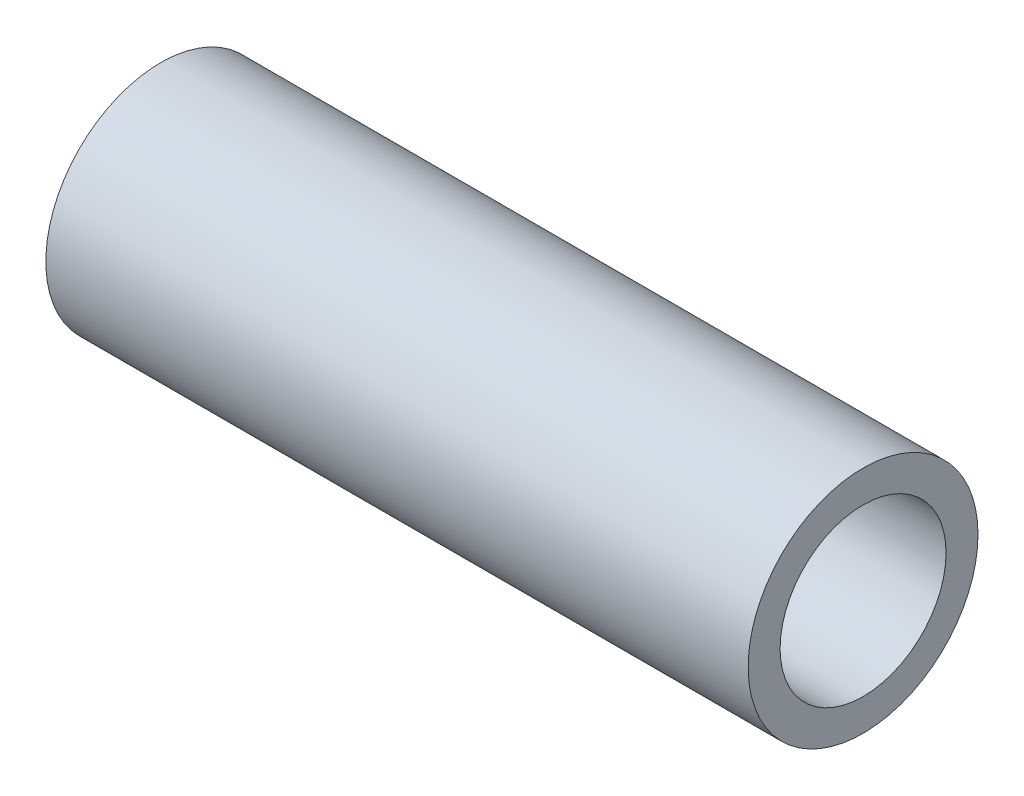
ISO-10303-21;
HEADER;
FILE_DESCRIPTION(('STEP AP214'),'2;1');
FILE_NAME('part.step','',(''),(''),'','','');
FILE_SCHEMA(('AUTOMOTIVE_DESIGN { 1 0 10303 214 1 1 1 1 }'));
ENDSEC;
DATA;
#1=APPLICATION_CONTEXT('core data for automotive mechanical design processes');
#2=APPLICATION_PROTOCOL_DEFINITION('international standard','automotive_design',2000,#1);
#3=PRODUCT_CONTEXT('',#1,'mechanical');
#4=PRODUCT('Part','Part','',(#3));
#5=PRODUCT_RELATED_PRODUCT_CATEGORY('part','',(#4));
#6=PRODUCT_DEFINITION_FORMATION('','',#4);
#7=PRODUCT_DEFINITION_CONTEXT('part definition',#1,'design');
#8=PRODUCT_DEFINITION('design','',#6,#7);
#9=PRODUCT_DEFINITION_SHAPE('','',#8);
#10=(LENGTH_UNIT() NAMED_UNIT(*) SI_UNIT(.MILLI.,.METRE.));
#11=(NAMED_UNIT(*) PLANE_ANGLE_UNIT() SI_UNIT($,.RADIAN.));
#12=(NAMED_UNIT(*) SI_UNIT($,.STERADIAN.) SOLID_ANGLE_UNIT());
#13=UNCERTAINTY_MEASURE_WITH_UNIT(LENGTH_MEASURE(1.E-05),#10,'distance_accuracy_value','');
#14=(GEOMETRIC_REPRESENTATION_CONTEXT(3) GLOBAL_UNCERTAINTY_ASSIGNED_CONTEXT((#13)) GLOBAL_UNIT_ASSIGNED_CONTEXT((#10,
#11,#12)) REPRESENTATION_CONTEXT('',''));
#15=CARTESIAN_POINT('',(0.,0.,0.));
#16=DIRECTION('',(0.,0.,1.));
#17=DIRECTION('',(1.,0.,0.));
#18=AXIS2_PLACEMENT_3D('',#15,#16,#17);
#19=CARTESIAN_POINT('',(27.5,0.,0.));
#20=DIRECTION('',(1.,0.,0.));
#21=DIRECTION('',(0.,0.,-1.));
#22=AXIS2_PLACEMENT_3D('',#19,#20,#21);
#23=PLANE('',#22);
#24=CARTESIAN_POINT('',(27.5,0.,0.));
#25=DIRECTION('',(1.,0.,0.));
#26=DIRECTION('',(0.,0.,-1.));
#27=AXIS2_PLACEMENT_3D('',#24,#25,#26);
#28=CIRCLE('',#27,9.00000000000001);
#29=CARTESIAN_POINT('',(27.5,0.,-9.00000000000001));
#30=VERTEX_POINT('',#29);
#31=EDGE_CURVE('E10',#30,#30,#28,.T.);
#32=ORIENTED_EDGE('',*,*,#31,.T.);
#33=EDGE_LOOP('',(#32));
#34=FACE_BOUND('',#33,.T.);
#35=CARTESIAN_POINT('',(27.5,0.,0.));
#36=DIRECTION('',(1.,0.,0.));
#37=DIRECTION('',(0.,0.,-1.));
#38=AXIS2_PLACEMENT_3D('',#35,#36,#37);
#39=CIRCLE('',#38,6.50000000000001);
#40=CARTESIAN_POINT('',(27.5,0.,-6.50000000000001));
#41=VERTEX_POINT('',#40);
#42=EDGE_CURVE('E46',#41,#41,#39,.T.);
#43=ORIENTED_EDGE('',*,*,#42,.F.);
#44=EDGE_LOOP('',(#43));
#45=FACE_BOUND('',#44,.T.);
#46=ADVANCED_FACE('F34',(#34,#45),#23,.T.);
#47=CARTESIAN_POINT('',(-27.5,0.,0.));
#48=DIRECTION('',(1.,0.,0.));
#49=DIRECTION('',(0.,0.,-1.));
#50=AXIS2_PLACEMENT_3D('',#47,#48,#49);
#51=PLANE('',#50);
#52=CARTESIAN_POINT('',(-27.5,0.,0.));
#53=DIRECTION('',(1.,0.,0.));
#54=DIRECTION('',(0.,0.,-1.));
#55=AXIS2_PLACEMENT_3D('',#52,#53,#54);
#56=CIRCLE('',#55,9.00000000000001);
#57=CARTESIAN_POINT('',(-27.5,0.,-9.00000000000001));
#58=VERTEX_POINT('',#57);
#59=EDGE_CURVE('E39',#58,#58,#56,.T.);
#60=ORIENTED_EDGE('',*,*,#59,.F.);
#61=EDGE_LOOP('',(#60));
#62=FACE_BOUND('',#61,.T.);
#63=CARTESIAN_POINT('',(-27.5,0.,0.));
#64=DIRECTION('',(1.,0.,0.));
#65=DIRECTION('',(0.,0.,-1.));
#66=AXIS2_PLACEMENT_3D('',#63,#64,#65);
#67=CIRCLE('',#66,6.50000000000001);
#68=CARTESIAN_POINT('',(-27.5,0.,-6.50000000000001));
#69=VERTEX_POINT('',#68);
#70=EDGE_CURVE('E48',#69,#69,#67,.T.);
#71=ORIENTED_EDGE('',*,*,#70,.T.);
#72=EDGE_LOOP('',(#71));
#73=FACE_BOUND('',#72,.T.);
#74=ADVANCED_FACE('F59',(#62,#73),#51,.F.);
#75=CARTESIAN_POINT('',(27.5,0.,0.));
#76=DIRECTION('',(-1.,0.,0.));
#77=DIRECTION('',(0.,0.,1.));
#78=AXIS2_PLACEMENT_3D('',#75,#76,#77);
#79=CYLINDRICAL_SURFACE('',#78,9.00000000000001);
#80=ORIENTED_EDGE('',*,*,#31,.F.);
#81=EDGE_LOOP('',(#80));
#82=FACE_BOUND('',#81,.T.);
#83=ORIENTED_EDGE('',*,*,#59,.T.);
#84=EDGE_LOOP('',(#83));
#85=FACE_BOUND('',#84,.T.);
#86=ADVANCED_FACE('F40',(#82,#85),#79,.T.);
#87=CARTESIAN_POINT('',(27.5,0.,0.));
#88=DIRECTION('',(-1.,0.,0.));
#89=DIRECTION('',(0.,0.,1.));
#90=AXIS2_PLACEMENT_3D('',#87,#88,#89);
#91=CYLINDRICAL_SURFACE('',#90,6.50000000000001);
#92=ORIENTED_EDGE('',*,*,#42,.T.);
#93=EDGE_LOOP('',(#92));
#94=FACE_BOUND('',#93,.T.);
#95=ORIENTED_EDGE('',*,*,#70,.F.);
#96=EDGE_LOOP('',(#95));
#97=FACE_BOUND('',#96,.T.);
#98=ADVANCED_FACE('F53',(#94,#97),#91,.F.);
#99=CLOSED_SHELL('',(#46,#74,#86,#98));
#100=MANIFOLD_SOLID_BREP('B2',#99);
#101=ADVANCED_BREP_SHAPE_REPRESENTATION('',(#18,#100),#14);
#102=SHAPE_DEFINITION_REPRESENTATION(#9,#101);
ENDSEC;
END-ISO-10303-21;
